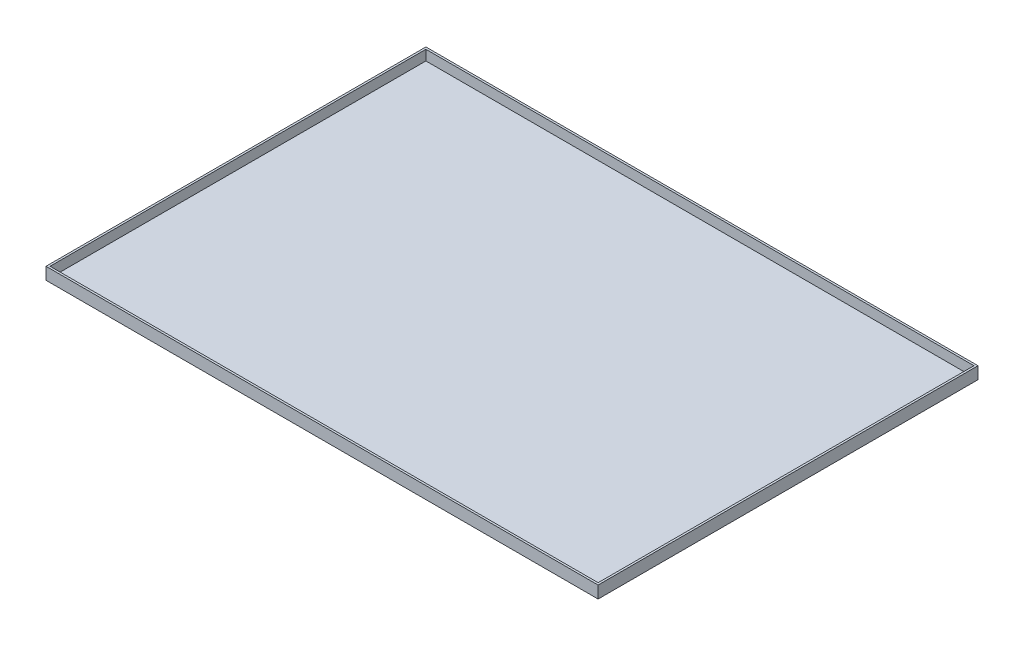
ISO-10303-21;
HEADER;
FILE_DESCRIPTION(('STEP AP214'),'2;1');
FILE_NAME('part.step','',(''),(''),'','','');
FILE_SCHEMA(('AUTOMOTIVE_DESIGN { 1 0 10303 214 1 1 1 1 }'));
ENDSEC;
DATA;
#1=APPLICATION_CONTEXT('core data for automotive mechanical design processes');
#2=APPLICATION_PROTOCOL_DEFINITION('international standard','automotive_design',2000,#1);
#3=PRODUCT_CONTEXT('',#1,'mechanical');
#4=PRODUCT('Part','Part','',(#3));
#5=PRODUCT_RELATED_PRODUCT_CATEGORY('part','',(#4));
#6=PRODUCT_DEFINITION_FORMATION('','',#4);
#7=PRODUCT_DEFINITION_CONTEXT('part definition',#1,'design');
#8=PRODUCT_DEFINITION('design','',#6,#7);
#9=PRODUCT_DEFINITION_SHAPE('','',#8);
#10=(LENGTH_UNIT() NAMED_UNIT(*) SI_UNIT(.MILLI.,.METRE.));
#11=(NAMED_UNIT(*) PLANE_ANGLE_UNIT() SI_UNIT($,.RADIAN.));
#12=(NAMED_UNIT(*) SI_UNIT($,.STERADIAN.) SOLID_ANGLE_UNIT());
#13=UNCERTAINTY_MEASURE_WITH_UNIT(LENGTH_MEASURE(1.E-05),#10,'distance_accuracy_value','');
#14=(GEOMETRIC_REPRESENTATION_CONTEXT(3) GLOBAL_UNCERTAINTY_ASSIGNED_CONTEXT((#13)) GLOBAL_UNIT_ASSIGNED_CONTEXT((#10,
#11,#12)) REPRESENTATION_CONTEXT('',''));
#15=CARTESIAN_POINT('',(0.,0.,0.));
#16=DIRECTION('',(0.,0.,1.));
#17=DIRECTION('',(1.,0.,0.));
#18=AXIS2_PLACEMENT_3D('',#15,#16,#17);
#19=CARTESIAN_POINT('',(0.,24.,0.));
#20=DIRECTION('',(0.,-1.,0.));
#21=DIRECTION('',(0.,0.,-1.));
#22=AXIS2_PLACEMENT_3D('',#19,#20,#21);
#23=PLANE('',#22);
#24=DIRECTION('',(0.,0.,-1.));
#25=VECTOR('',#24,1.);
#26=CARTESIAN_POINT('',(545.,24.,375.));
#27=LINE('',#26,#25);
#28=CARTESIAN_POINT('',(545.,24.,375.));
#29=VERTEX_POINT('',#28);
#30=CARTESIAN_POINT('',(545.,24.,-375.));
#31=VERTEX_POINT('',#30);
#32=EDGE_CURVE('E125',#29,#31,#27,.T.);
#33=ORIENTED_EDGE('',*,*,#32,.T.);
#34=DIRECTION('',(-1.,0.,0.));
#35=VECTOR('',#34,1.);
#36=CARTESIAN_POINT('',(-545.,24.,-375.));
#37=LINE('',#36,#35);
#38=CARTESIAN_POINT('',(-545.,24.,-375.));
#39=VERTEX_POINT('',#38);
#40=EDGE_CURVE('E69',#31,#39,#37,.T.);
#41=ORIENTED_EDGE('',*,*,#40,.T.);
#42=DIRECTION('',(0.,0.,1.));
#43=VECTOR('',#42,1.);
#44=CARTESIAN_POINT('',(-545.,24.,375.));
#45=LINE('',#44,#43);
#46=CARTESIAN_POINT('',(-545.,24.,375.));
#47=VERTEX_POINT('',#46);
#48=EDGE_CURVE('E128',#39,#47,#45,.T.);
#49=ORIENTED_EDGE('',*,*,#48,.T.);
#50=DIRECTION('',(1.,0.,0.));
#51=VECTOR('',#50,1.);
#52=CARTESIAN_POINT('',(-545.,24.,375.));
#53=LINE('',#52,#51);
#54=EDGE_CURVE('E41',#47,#29,#53,.T.);
#55=ORIENTED_EDGE('',*,*,#54,.T.);
#56=EDGE_LOOP('',(#33,#41,#49,#55));
#57=FACE_BOUND('',#56,.T.);
#58=DIRECTION('',(0.,0.,-1.));
#59=VECTOR('',#58,1.);
#60=CARTESIAN_POINT('',(541.,24.,0.));
#61=LINE('',#60,#59);
#62=CARTESIAN_POINT('',(541.,24.,371.));
#63=VERTEX_POINT('',#62);
#64=CARTESIAN_POINT('',(541.,24.,-371.));
#65=VERTEX_POINT('',#64);
#66=EDGE_CURVE('E114',#63,#65,#61,.T.);
#67=ORIENTED_EDGE('',*,*,#66,.F.);
#68=DIRECTION('',(1.,0.,0.));
#69=VECTOR('',#68,1.);
#70=CARTESIAN_POINT('',(0.,24.,371.));
#71=LINE('',#70,#69);
#72=CARTESIAN_POINT('',(-541.,24.,371.));
#73=VERTEX_POINT('',#72);
#74=EDGE_CURVE('E123',#73,#63,#71,.T.);
#75=ORIENTED_EDGE('',*,*,#74,.F.);
#76=DIRECTION('',(0.,0.,1.));
#77=VECTOR('',#76,1.);
#78=CARTESIAN_POINT('',(-541.,24.,0.));
#79=LINE('',#78,#77);
#80=CARTESIAN_POINT('',(-541.,24.,-371.));
#81=VERTEX_POINT('',#80);
#82=EDGE_CURVE('E121',#81,#73,#79,.T.);
#83=ORIENTED_EDGE('',*,*,#82,.F.);
#84=DIRECTION('',(-1.,0.,0.));
#85=VECTOR('',#84,1.);
#86=CARTESIAN_POINT('',(0.,24.,-371.));
#87=LINE('',#86,#85);
#88=EDGE_CURVE('E106',#65,#81,#87,.T.);
#89=ORIENTED_EDGE('',*,*,#88,.F.);
#90=EDGE_LOOP('',(#67,#75,#83,#89));
#91=FACE_BOUND('',#90,.T.);
#92=ADVANCED_FACE('F17',(#57,#91),#23,.F.);
#93=CARTESIAN_POINT('',(545.,24.,375.));
#94=DIRECTION('',(-1.,0.,0.));
#95=DIRECTION('',(0.,0.,1.));
#96=AXIS2_PLACEMENT_3D('',#93,#94,#95);
#97=PLANE('',#96);
#98=DIRECTION('',(0.,0.,-1.));
#99=VECTOR('',#98,1.);
#100=CARTESIAN_POINT('',(545.,0.,375.));
#101=LINE('',#100,#99);
#102=CARTESIAN_POINT('',(545.,0.,375.));
#103=VERTEX_POINT('',#102);
#104=CARTESIAN_POINT('',(545.,0.,-375.));
#105=VERTEX_POINT('',#104);
#106=EDGE_CURVE('E132',#103,#105,#101,.T.);
#107=ORIENTED_EDGE('',*,*,#106,.T.);
#108=DIRECTION('',(0.,-1.,0.));
#109=VECTOR('',#108,1.);
#110=CARTESIAN_POINT('',(545.,24.,-375.));
#111=LINE('',#110,#109);
#112=EDGE_CURVE('E11',#31,#105,#111,.T.);
#113=ORIENTED_EDGE('',*,*,#112,.F.);
#114=ORIENTED_EDGE('',*,*,#32,.F.);
#115=DIRECTION('',(0.,-1.,0.));
#116=VECTOR('',#115,1.);
#117=CARTESIAN_POINT('',(545.,24.,375.));
#118=LINE('',#117,#116);
#119=EDGE_CURVE('E131',#29,#103,#118,.T.);
#120=ORIENTED_EDGE('',*,*,#119,.T.);
#121=EDGE_LOOP('',(#107,#113,#114,#120));
#122=FACE_BOUND('',#121,.T.);
#123=ADVANCED_FACE('F19',(#122),#97,.F.);
#124=CARTESIAN_POINT('',(-545.,24.,-375.));
#125=DIRECTION('',(0.,0.,1.));
#126=DIRECTION('',(1.,0.,0.));
#127=AXIS2_PLACEMENT_3D('',#124,#125,#126);
#128=PLANE('',#127);
#129=DIRECTION('',(-1.,0.,0.));
#130=VECTOR('',#129,1.);
#131=CARTESIAN_POINT('',(-545.,0.,-375.));
#132=LINE('',#131,#130);
#133=CARTESIAN_POINT('',(-545.,0.,-375.));
#134=VERTEX_POINT('',#133);
#135=EDGE_CURVE('E135',#105,#134,#132,.T.);
#136=ORIENTED_EDGE('',*,*,#135,.T.);
#137=DIRECTION('',(0.,-1.,0.));
#138=VECTOR('',#137,1.);
#139=CARTESIAN_POINT('',(-545.,24.,-375.));
#140=LINE('',#139,#138);
#141=EDGE_CURVE('E25',#39,#134,#140,.T.);
#142=ORIENTED_EDGE('',*,*,#141,.F.);
#143=ORIENTED_EDGE('',*,*,#40,.F.);
#144=ORIENTED_EDGE('',*,*,#112,.T.);
#145=EDGE_LOOP('',(#136,#142,#143,#144));
#146=FACE_BOUND('',#145,.T.);
#147=ADVANCED_FACE('F165',(#146),#128,.F.);
#148=CARTESIAN_POINT('',(-545.,24.,375.));
#149=DIRECTION('',(1.,0.,0.));
#150=DIRECTION('',(0.,0.,-1.));
#151=AXIS2_PLACEMENT_3D('',#148,#149,#150);
#152=PLANE('',#151);
#153=DIRECTION('',(0.,0.,1.));
#154=VECTOR('',#153,1.);
#155=CARTESIAN_POINT('',(-545.,0.,375.));
#156=LINE('',#155,#154);
#157=CARTESIAN_POINT('',(-545.,0.,375.));
#158=VERTEX_POINT('',#157);
#159=EDGE_CURVE('E137',#134,#158,#156,.T.);
#160=ORIENTED_EDGE('',*,*,#159,.T.);
#161=DIRECTION('',(0.,-1.,0.));
#162=VECTOR('',#161,1.);
#163=CARTESIAN_POINT('',(-545.,24.,375.));
#164=LINE('',#163,#162);
#165=EDGE_CURVE('E141',#47,#158,#164,.T.);
#166=ORIENTED_EDGE('',*,*,#165,.F.);
#167=ORIENTED_EDGE('',*,*,#48,.F.);
#168=ORIENTED_EDGE('',*,*,#141,.T.);
#169=EDGE_LOOP('',(#160,#166,#167,#168));
#170=FACE_BOUND('',#169,.T.);
#171=ADVANCED_FACE('F146',(#170),#152,.F.);
#172=CARTESIAN_POINT('',(-545.,24.,375.));
#173=DIRECTION('',(0.,0.,-1.));
#174=DIRECTION('',(-1.,0.,0.));
#175=AXIS2_PLACEMENT_3D('',#172,#173,#174);
#176=PLANE('',#175);
#177=DIRECTION('',(1.,0.,0.));
#178=VECTOR('',#177,1.);
#179=CARTESIAN_POINT('',(-545.,0.,375.));
#180=LINE('',#179,#178);
#181=EDGE_CURVE('E62',#158,#103,#180,.T.);
#182=ORIENTED_EDGE('',*,*,#181,.T.);
#183=ORIENTED_EDGE('',*,*,#119,.F.);
#184=ORIENTED_EDGE('',*,*,#54,.F.);
#185=ORIENTED_EDGE('',*,*,#165,.T.);
#186=EDGE_LOOP('',(#182,#183,#184,#185));
#187=FACE_BOUND('',#186,.T.);
#188=ADVANCED_FACE('F154',(#187),#176,.F.);
#189=CARTESIAN_POINT('',(0.,0.,0.));
#190=DIRECTION('',(0.,-1.,0.));
#191=DIRECTION('',(0.,0.,-1.));
#192=AXIS2_PLACEMENT_3D('',#189,#190,#191);
#193=PLANE('',#192);
#194=ORIENTED_EDGE('',*,*,#106,.F.);
#195=ORIENTED_EDGE('',*,*,#181,.F.);
#196=ORIENTED_EDGE('',*,*,#159,.F.);
#197=ORIENTED_EDGE('',*,*,#135,.F.);
#198=EDGE_LOOP('',(#194,#195,#196,#197));
#199=FACE_BOUND('',#198,.T.);
#200=ADVANCED_FACE('F150',(#199),#193,.T.);
#201=CARTESIAN_POINT('',(541.,24.,375.));
#202=DIRECTION('',(-1.,0.,0.));
#203=DIRECTION('',(0.,0.,1.));
#204=AXIS2_PLACEMENT_3D('',#201,#202,#203);
#205=PLANE('',#204);
#206=DIRECTION('',(0.,0.,-1.));
#207=VECTOR('',#206,1.);
#208=CARTESIAN_POINT('',(541.,4.,0.));
#209=LINE('',#208,#207);
#210=CARTESIAN_POINT('',(541.,4.,371.));
#211=VERTEX_POINT('',#210);
#212=CARTESIAN_POINT('',(541.,4.,-371.));
#213=VERTEX_POINT('',#212);
#214=EDGE_CURVE('E97',#211,#213,#209,.T.);
#215=ORIENTED_EDGE('',*,*,#214,.F.);
#216=DIRECTION('',(0.,-1.,0.));
#217=VECTOR('',#216,1.);
#218=CARTESIAN_POINT('',(541.,24.,371.));
#219=LINE('',#218,#217);
#220=EDGE_CURVE('E117',#63,#211,#219,.T.);
#221=ORIENTED_EDGE('',*,*,#220,.F.);
#222=ORIENTED_EDGE('',*,*,#66,.T.);
#223=DIRECTION('',(0.,-1.,0.));
#224=VECTOR('',#223,1.);
#225=CARTESIAN_POINT('',(541.,24.,-371.));
#226=LINE('',#225,#224);
#227=EDGE_CURVE('E109',#65,#213,#226,.T.);
#228=ORIENTED_EDGE('',*,*,#227,.T.);
#229=EDGE_LOOP('',(#215,#221,#222,#228));
#230=FACE_BOUND('',#229,.T.);
#231=ADVANCED_FACE('F163',(#230),#205,.T.);
#232=CARTESIAN_POINT('',(-545.,24.,-371.));
#233=DIRECTION('',(0.,0.,1.));
#234=DIRECTION('',(1.,0.,0.));
#235=AXIS2_PLACEMENT_3D('',#232,#233,#234);
#236=PLANE('',#235);
#237=DIRECTION('',(-1.,0.,0.));
#238=VECTOR('',#237,1.);
#239=CARTESIAN_POINT('',(0.,4.,-371.));
#240=LINE('',#239,#238);
#241=CARTESIAN_POINT('',(-541.,4.,-371.));
#242=VERTEX_POINT('',#241);
#243=EDGE_CURVE('E91',#213,#242,#240,.T.);
#244=ORIENTED_EDGE('',*,*,#243,.F.);
#245=ORIENTED_EDGE('',*,*,#227,.F.);
#246=ORIENTED_EDGE('',*,*,#88,.T.);
#247=DIRECTION('',(0.,-1.,0.));
#248=VECTOR('',#247,1.);
#249=CARTESIAN_POINT('',(-541.,24.,-371.));
#250=LINE('',#249,#248);
#251=EDGE_CURVE('E103',#81,#242,#250,.T.);
#252=ORIENTED_EDGE('',*,*,#251,.T.);
#253=EDGE_LOOP('',(#244,#245,#246,#252));
#254=FACE_BOUND('',#253,.T.);
#255=ADVANCED_FACE('F104',(#254),#236,.T.);
#256=CARTESIAN_POINT('',(-541.,24.,375.));
#257=DIRECTION('',(1.,0.,0.));
#258=DIRECTION('',(0.,0.,-1.));
#259=AXIS2_PLACEMENT_3D('',#256,#257,#258);
#260=PLANE('',#259);
#261=DIRECTION('',(0.,0.,1.));
#262=VECTOR('',#261,1.);
#263=CARTESIAN_POINT('',(-541.,4.,0.));
#264=LINE('',#263,#262);
#265=CARTESIAN_POINT('',(-541.,4.,371.));
#266=VERTEX_POINT('',#265);
#267=EDGE_CURVE('E95',#242,#266,#264,.T.);
#268=ORIENTED_EDGE('',*,*,#267,.F.);
#269=ORIENTED_EDGE('',*,*,#251,.F.);
#270=ORIENTED_EDGE('',*,*,#82,.T.);
#271=DIRECTION('',(0.,-1.,0.));
#272=VECTOR('',#271,1.);
#273=CARTESIAN_POINT('',(-541.,24.,371.));
#274=LINE('',#273,#272);
#275=EDGE_CURVE('E32',#73,#266,#274,.T.);
#276=ORIENTED_EDGE('',*,*,#275,.T.);
#277=EDGE_LOOP('',(#268,#269,#270,#276));
#278=FACE_BOUND('',#277,.T.);
#279=ADVANCED_FACE('F111',(#278),#260,.T.);
#280=CARTESIAN_POINT('',(-545.,24.,371.));
#281=DIRECTION('',(0.,0.,-1.));
#282=DIRECTION('',(-1.,0.,0.));
#283=AXIS2_PLACEMENT_3D('',#280,#281,#282);
#284=PLANE('',#283);
#285=DIRECTION('',(1.,0.,0.));
#286=VECTOR('',#285,1.);
#287=CARTESIAN_POINT('',(0.,4.,371.));
#288=LINE('',#287,#286);
#289=EDGE_CURVE('E112',#266,#211,#288,.T.);
#290=ORIENTED_EDGE('',*,*,#289,.F.);
#291=ORIENTED_EDGE('',*,*,#275,.F.);
#292=ORIENTED_EDGE('',*,*,#74,.T.);
#293=ORIENTED_EDGE('',*,*,#220,.T.);
#294=EDGE_LOOP('',(#290,#291,#292,#293));
#295=FACE_BOUND('',#294,.T.);
#296=ADVANCED_FACE('F177',(#295),#284,.T.);
#297=CARTESIAN_POINT('',(0.,4.,0.));
#298=DIRECTION('',(0.,-1.,0.));
#299=DIRECTION('',(0.,0.,-1.));
#300=AXIS2_PLACEMENT_3D('',#297,#298,#299);
#301=PLANE('',#300);
#302=ORIENTED_EDGE('',*,*,#214,.T.);
#303=ORIENTED_EDGE('',*,*,#243,.T.);
#304=ORIENTED_EDGE('',*,*,#267,.T.);
#305=ORIENTED_EDGE('',*,*,#289,.T.);
#306=EDGE_LOOP('',(#302,#303,#304,#305));
#307=FACE_BOUND('',#306,.T.);
#308=ADVANCED_FACE('F93',(#307),#301,.F.);
#309=CLOSED_SHELL('',(#92,#123,#147,#171,#188,#200,#231,#255,#279,#296,#308));
#310=MANIFOLD_SOLID_BREP('B1',#309);
#311=ADVANCED_BREP_SHAPE_REPRESENTATION('',(#18,#310),#14);
#312=SHAPE_DEFINITION_REPRESENTATION(#9,#311);
ENDSEC;
END-ISO-10303-21;
